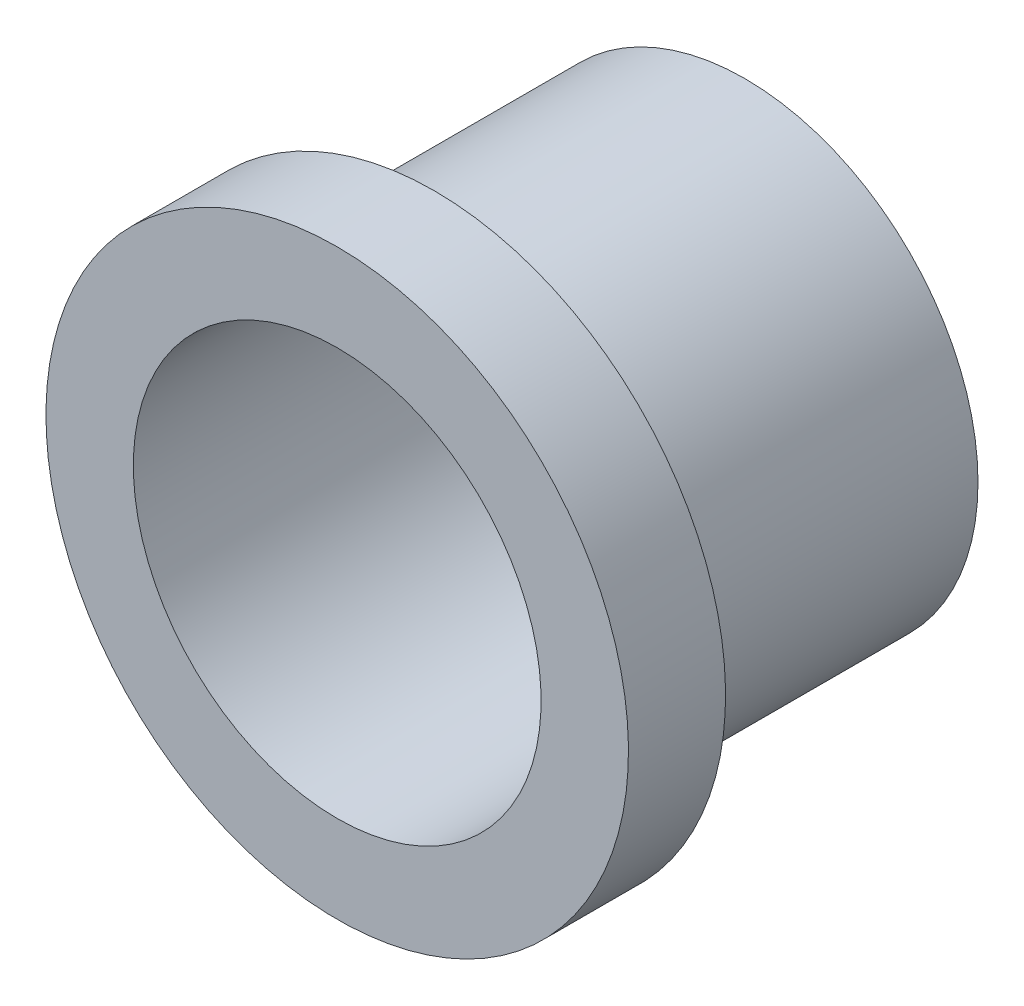
ISO-10303-21;
HEADER;
FILE_DESCRIPTION(('STEP AP214'),'2;1');
FILE_NAME('part.step','',(''),(''),'','','');
FILE_SCHEMA(('AUTOMOTIVE_DESIGN { 1 0 10303 214 1 1 1 1 }'));
ENDSEC;
DATA;
#1=APPLICATION_CONTEXT('core data for automotive mechanical design processes');
#2=APPLICATION_PROTOCOL_DEFINITION('international standard','automotive_design',2000,#1);
#3=PRODUCT_CONTEXT('',#1,'mechanical');
#4=PRODUCT('Part','Part','',(#3));
#5=PRODUCT_RELATED_PRODUCT_CATEGORY('part','',(#4));
#6=PRODUCT_DEFINITION_FORMATION('','',#4);
#7=PRODUCT_DEFINITION_CONTEXT('part definition',#1,'design');
#8=PRODUCT_DEFINITION('design','',#6,#7);
#9=PRODUCT_DEFINITION_SHAPE('','',#8);
#10=(LENGTH_UNIT() NAMED_UNIT(*) SI_UNIT(.MILLI.,.METRE.));
#11=(NAMED_UNIT(*) PLANE_ANGLE_UNIT() SI_UNIT($,.RADIAN.));
#12=(NAMED_UNIT(*) SI_UNIT($,.STERADIAN.) SOLID_ANGLE_UNIT());
#13=UNCERTAINTY_MEASURE_WITH_UNIT(LENGTH_MEASURE(1.E-05),#10,'distance_accuracy_value','');
#14=(GEOMETRIC_REPRESENTATION_CONTEXT(3) GLOBAL_UNCERTAINTY_ASSIGNED_CONTEXT((#13)) GLOBAL_UNIT_ASSIGNED_CONTEXT((#10,
#11,#12)) REPRESENTATION_CONTEXT('',''));
#15=CARTESIAN_POINT('',(0.,0.,0.));
#16=DIRECTION('',(0.,0.,1.));
#17=DIRECTION('',(1.,0.,0.));
#18=AXIS2_PLACEMENT_3D('',#15,#16,#17);
#19=CARTESIAN_POINT('',(0.,0.,-10.5));
#20=DIRECTION('',(0.,0.,-1.));
#21=DIRECTION('',(0.,1.,0.));
#22=AXIS2_PLACEMENT_3D('',#19,#20,#21);
#23=PLANE('',#22);
#24=CARTESIAN_POINT('',(0.,0.,-10.5));
#25=DIRECTION('',(0.,0.,-1.));
#26=DIRECTION('',(0.,1.,0.));
#27=AXIS2_PLACEMENT_3D('',#24,#25,#26);
#28=CIRCLE('',#27,10.5);
#29=CARTESIAN_POINT('',(0.,10.5,-10.5));
#30=VERTEX_POINT('',#29);
#31=EDGE_CURVE('E58',#30,#30,#28,.T.);
#32=ORIENTED_EDGE('',*,*,#31,.F.);
#33=EDGE_LOOP('',(#32));
#34=FACE_BOUND('',#33,.T.);
#35=CARTESIAN_POINT('',(0.,0.,-10.5));
#36=DIRECTION('',(0.,0.,-1.));
#37=DIRECTION('',(0.,1.,0.));
#38=AXIS2_PLACEMENT_3D('',#35,#36,#37);
#39=CIRCLE('',#38,12.);
#40=CARTESIAN_POINT('',(0.,12.,-10.5));
#41=VERTEX_POINT('',#40);
#42=EDGE_CURVE('E10',#41,#41,#39,.T.);
#43=ORIENTED_EDGE('',*,*,#42,.T.);
#44=EDGE_LOOP('',(#43));
#45=FACE_BOUND('',#44,.T.);
#46=ADVANCED_FACE('F38',(#34,#45),#23,.T.);
#47=CARTESIAN_POINT('',(0.,0.,-10.5));
#48=DIRECTION('',(0.,0.,-1.));
#49=DIRECTION('',(0.,1.,0.));
#50=AXIS2_PLACEMENT_3D('',#47,#48,#49);
#51=CYLINDRICAL_SURFACE('',#50,12.);
#52=CARTESIAN_POINT('',(0.,0.,5.5));
#53=DIRECTION('',(0.,0.,-1.));
#54=DIRECTION('',(0.,1.,0.));
#55=AXIS2_PLACEMENT_3D('',#52,#53,#54);
#56=CIRCLE('',#55,12.);
#57=CARTESIAN_POINT('',(0.,12.,5.50000000000001));
#58=VERTEX_POINT('',#57);
#59=EDGE_CURVE('E44',#58,#58,#56,.T.);
#60=ORIENTED_EDGE('',*,*,#59,.T.);
#61=EDGE_LOOP('',(#60));
#62=FACE_BOUND('',#61,.T.);
#63=ORIENTED_EDGE('',*,*,#42,.F.);
#64=EDGE_LOOP('',(#63));
#65=FACE_BOUND('',#64,.T.);
#66=ADVANCED_FACE('F74',(#62,#65),#51,.T.);
#67=CARTESIAN_POINT('',(0.,0.,5.5));
#68=DIRECTION('',(0.,0.,1.));
#69=DIRECTION('',(0.,-1.,0.));
#70=AXIS2_PLACEMENT_3D('',#67,#68,#69);
#71=PLANE('',#70);
#72=ORIENTED_EDGE('',*,*,#59,.F.);
#73=EDGE_LOOP('',(#72));
#74=FACE_BOUND('',#73,.T.);
#75=CARTESIAN_POINT('',(0.,0.,5.50000000000001));
#76=DIRECTION('',(0.,0.,-1.));
#77=DIRECTION('',(0.,1.,0.));
#78=AXIS2_PLACEMENT_3D('',#75,#76,#77);
#79=CIRCLE('',#78,15.);
#80=CARTESIAN_POINT('',(0.,15.,5.50000000000001));
#81=VERTEX_POINT('',#80);
#82=EDGE_CURVE('E48',#81,#81,#79,.T.);
#83=ORIENTED_EDGE('',*,*,#82,.T.);
#84=EDGE_LOOP('',(#83));
#85=FACE_BOUND('',#84,.T.);
#86=ADVANCED_FACE('F78',(#74,#85),#71,.F.);
#87=CARTESIAN_POINT('',(0.,0.,-10.5));
#88=DIRECTION('',(0.,0.,-1.));
#89=DIRECTION('',(0.,1.,0.));
#90=AXIS2_PLACEMENT_3D('',#87,#88,#89);
#91=CYLINDRICAL_SURFACE('',#90,15.);
#92=ORIENTED_EDGE('',*,*,#82,.F.);
#93=EDGE_LOOP('',(#92));
#94=FACE_BOUND('',#93,.T.);
#95=CARTESIAN_POINT('',(0.,0.,10.5));
#96=DIRECTION('',(0.,0.,-1.));
#97=DIRECTION('',(0.,1.,0.));
#98=AXIS2_PLACEMENT_3D('',#95,#96,#97);
#99=CIRCLE('',#98,15.);
#100=CARTESIAN_POINT('',(0.,15.,10.5));
#101=VERTEX_POINT('',#100);
#102=EDGE_CURVE('E52',#101,#101,#99,.T.);
#103=ORIENTED_EDGE('',*,*,#102,.T.);
#104=EDGE_LOOP('',(#103));
#105=FACE_BOUND('',#104,.T.);
#106=ADVANCED_FACE('F82',(#94,#105),#91,.T.);
#107=CARTESIAN_POINT('',(0.,0.,10.5));
#108=DIRECTION('',(0.,0.,-1.));
#109=DIRECTION('',(0.,1.,0.));
#110=AXIS2_PLACEMENT_3D('',#107,#108,#109);
#111=PLANE('',#110);
#112=CARTESIAN_POINT('',(0.,0.,10.5));
#113=DIRECTION('',(0.,0.,-1.));
#114=DIRECTION('',(0.,1.,0.));
#115=AXIS2_PLACEMENT_3D('',#112,#113,#114);
#116=CIRCLE('',#115,10.5);
#117=CARTESIAN_POINT('',(0.,10.5,10.5));
#118=VERTEX_POINT('',#117);
#119=EDGE_CURVE('E57',#118,#118,#116,.T.);
#120=ORIENTED_EDGE('',*,*,#119,.T.);
#121=EDGE_LOOP('',(#120));
#122=FACE_BOUND('',#121,.T.);
#123=ORIENTED_EDGE('',*,*,#102,.F.);
#124=EDGE_LOOP('',(#123));
#125=FACE_BOUND('',#124,.T.);
#126=ADVANCED_FACE('F64',(#122,#125),#111,.F.);
#127=CARTESIAN_POINT('',(0.,0.,10.5));
#128=DIRECTION('',(0.,0.,-1.));
#129=DIRECTION('',(0.,1.,0.));
#130=AXIS2_PLACEMENT_3D('',#127,#128,#129);
#131=CYLINDRICAL_SURFACE('',#130,10.5);
#132=ORIENTED_EDGE('',*,*,#119,.F.);
#133=EDGE_LOOP('',(#132));
#134=FACE_BOUND('',#133,.T.);
#135=ORIENTED_EDGE('',*,*,#31,.T.);
#136=EDGE_LOOP('',(#135));
#137=FACE_BOUND('',#136,.T.);
#138=ADVANCED_FACE('F67',(#134,#137),#131,.F.);
#139=CLOSED_SHELL('',(#46,#66,#86,#106,#126,#138));
#140=MANIFOLD_SOLID_BREP('B2',#139);
#141=ADVANCED_BREP_SHAPE_REPRESENTATION('',(#18,#140),#14);
#142=SHAPE_DEFINITION_REPRESENTATION(#9,#141);
ENDSEC;
END-ISO-10303-21;
